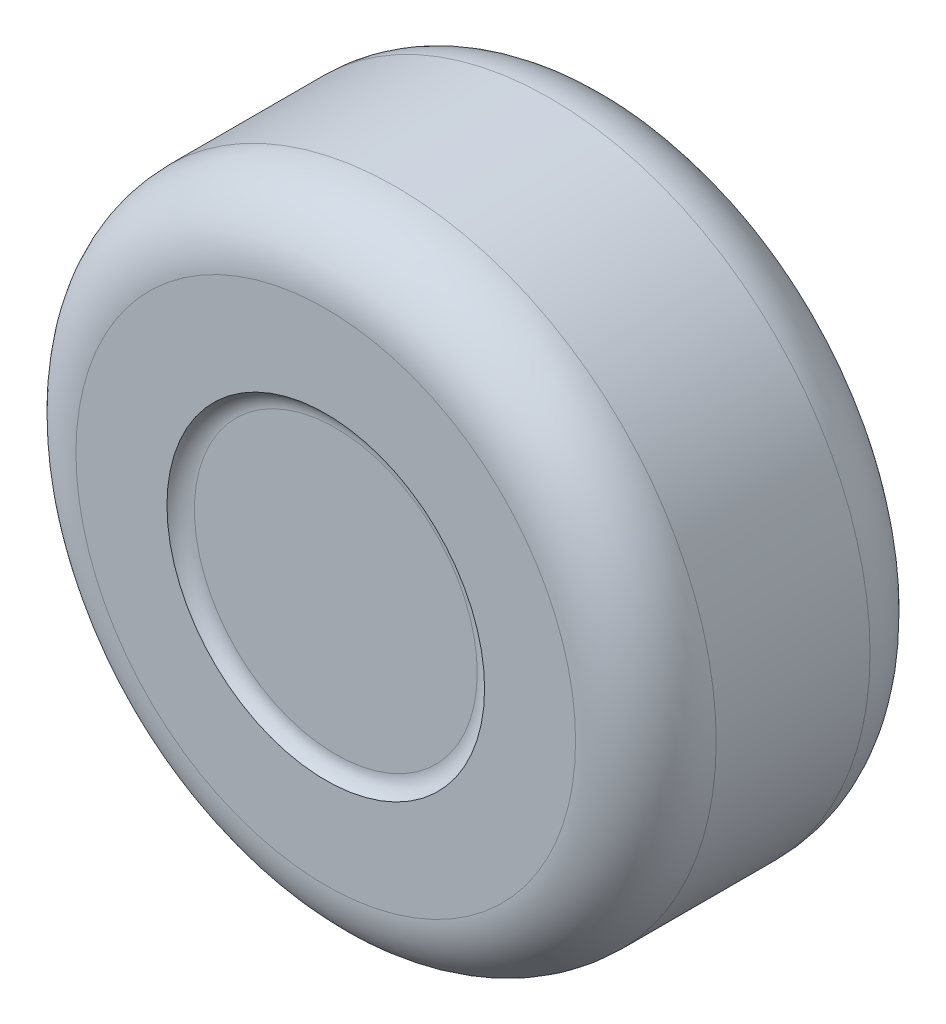
ISO-10303-21;
HEADER;
FILE_DESCRIPTION(('STEP AP214'),'2;1');
FILE_NAME('part.step','',(''),(''),'','','');
FILE_SCHEMA(('AUTOMOTIVE_DESIGN { 1 0 10303 214 1 1 1 1 }'));
ENDSEC;
DATA;
#1=APPLICATION_CONTEXT('core data for automotive mechanical design processes');
#2=APPLICATION_PROTOCOL_DEFINITION('international standard','automotive_design',2000,#1);
#3=PRODUCT_CONTEXT('',#1,'mechanical');
#4=PRODUCT('Part','Part','',(#3));
#5=PRODUCT_RELATED_PRODUCT_CATEGORY('part','',(#4));
#6=PRODUCT_DEFINITION_FORMATION('','',#4);
#7=PRODUCT_DEFINITION_CONTEXT('part definition',#1,'design');
#8=PRODUCT_DEFINITION('design','',#6,#7);
#9=PRODUCT_DEFINITION_SHAPE('','',#8);
#10=(LENGTH_UNIT() NAMED_UNIT(*) SI_UNIT(.MILLI.,.METRE.));
#11=(NAMED_UNIT(*) PLANE_ANGLE_UNIT() SI_UNIT($,.RADIAN.));
#12=(NAMED_UNIT(*) SI_UNIT($,.STERADIAN.) SOLID_ANGLE_UNIT());
#13=UNCERTAINTY_MEASURE_WITH_UNIT(LENGTH_MEASURE(1.E-05),#10,'distance_accuracy_value','');
#14=(GEOMETRIC_REPRESENTATION_CONTEXT(3) GLOBAL_UNCERTAINTY_ASSIGNED_CONTEXT((#13)) GLOBAL_UNIT_ASSIGNED_CONTEXT((#10,
#11,#12)) REPRESENTATION_CONTEXT('',''));
#15=CARTESIAN_POINT('',(0.,0.,0.));
#16=DIRECTION('',(0.,0.,1.));
#17=DIRECTION('',(1.,0.,0.));
#18=AXIS2_PLACEMENT_3D('',#15,#16,#17);
#19=CARTESIAN_POINT('',(0.,0.,29.32));
#20=DIRECTION('',(0.,0.,-1.));
#21=DIRECTION('',(-1.,0.,0.));
#22=AXIS2_PLACEMENT_3D('',#19,#20,#21);
#23=CYLINDRICAL_SURFACE('',#22,63.75);
#24=CARTESIAN_POINT('',(0.,0.,-15.32));
#25=DIRECTION('',(0.,0.,1.));
#26=DIRECTION('',(1.,0.,0.));
#27=AXIS2_PLACEMENT_3D('',#24,#25,#26);
#28=CIRCLE('',#27,63.75);
#29=CARTESIAN_POINT('',(-63.75,0.,-15.32));
#30=VERTEX_POINT('',#29);
#31=EDGE_CURVE('E47',#30,#30,#28,.T.);
#32=CARTESIAN_POINT('',(0.,0.,15.32));
#33=DIRECTION('',(0.,0.,1.));
#34=DIRECTION('',(1.,0.,0.));
#35=AXIS2_PLACEMENT_3D('',#32,#33,#34);
#36=CIRCLE('',#35,63.75);
#37=CARTESIAN_POINT('',(-63.75,0.,15.32));
#38=VERTEX_POINT('',#37);
#39=EDGE_CURVE('E52',#38,#38,#36,.F.);
#40=CARTESIAN_POINT('',(-63.75,0.,-15.32));
#41=CARTESIAN_POINT('',(-63.75,0.,-15.0008333333333));
#42=CARTESIAN_POINT('',(-63.75,0.,-14.6816666666667));
#43=CARTESIAN_POINT('',(-63.75,0.,-14.0433333333333));
#44=CARTESIAN_POINT('',(-63.75,0.,-13.7241666666667));
#45=CARTESIAN_POINT('',(-63.75,0.,-13.0858333333333));
#46=CARTESIAN_POINT('',(-63.75,0.,-12.7666666666667));
#47=CARTESIAN_POINT('',(-63.75,0.,-12.1283333333333));
#48=CARTESIAN_POINT('',(-63.75,0.,-11.8091666666667));
#49=CARTESIAN_POINT('',(-63.75,0.,-11.1708333333333));
#50=CARTESIAN_POINT('',(-63.75,0.,-10.8516666666667));
#51=CARTESIAN_POINT('',(-63.75,0.,-10.2133333333333));
#52=CARTESIAN_POINT('',(-63.75,0.,-9.89416666666667));
#53=CARTESIAN_POINT('',(-63.75,0.,-9.25583333333334));
#54=CARTESIAN_POINT('',(-63.75,0.,-8.93666666666667));
#55=CARTESIAN_POINT('',(-63.75,0.,-8.29833333333334));
#56=CARTESIAN_POINT('',(-63.75,0.,-7.97916666666667));
#57=CARTESIAN_POINT('',(-63.75,0.,-7.34083333333334));
#58=CARTESIAN_POINT('',(-63.75,0.,-7.02166666666667));
#59=CARTESIAN_POINT('',(-63.75,0.,-6.38333333333334));
#60=CARTESIAN_POINT('',(-63.75,0.,-6.06416666666667));
#61=CARTESIAN_POINT('',(-63.75,0.,-5.42583333333334));
#62=CARTESIAN_POINT('',(-63.75,0.,-5.10666666666667));
#63=CARTESIAN_POINT('',(-63.75,0.,-4.46833333333334));
#64=CARTESIAN_POINT('',(-63.75,0.,-4.14916666666667));
#65=CARTESIAN_POINT('',(-63.75,0.,-3.51083333333334));
#66=CARTESIAN_POINT('',(-63.75,0.,-3.19166666666667));
#67=CARTESIAN_POINT('',(-63.75,0.,-2.55333333333334));
#68=CARTESIAN_POINT('',(-63.75,0.,-2.23416666666667));
#69=CARTESIAN_POINT('',(-63.75,0.,-1.59583333333334));
#70=CARTESIAN_POINT('',(-63.75,0.,-1.27666666666667));
#71=CARTESIAN_POINT('',(-63.75,0.,-0.63833333333334));
#72=CARTESIAN_POINT('',(-63.75,0.,-0.319166666666674));
#73=CARTESIAN_POINT('',(-63.75,0.,0.31916666666666));
#74=CARTESIAN_POINT('',(-63.75,0.,0.638333333333326));
#75=CARTESIAN_POINT('',(-63.75,0.,1.27666666666666));
#76=CARTESIAN_POINT('',(-63.75,0.,1.59583333333333));
#77=CARTESIAN_POINT('',(-63.75,0.,2.23416666666666));
#78=CARTESIAN_POINT('',(-63.75,0.,2.55333333333333));
#79=CARTESIAN_POINT('',(-63.75,0.,3.19166666666666));
#80=CARTESIAN_POINT('',(-63.75,0.,3.51083333333333));
#81=CARTESIAN_POINT('',(-63.75,0.,4.14916666666666));
#82=CARTESIAN_POINT('',(-63.75,0.,4.46833333333333));
#83=CARTESIAN_POINT('',(-63.75,0.,5.10666666666666));
#84=CARTESIAN_POINT('',(-63.75,0.,5.42583333333333));
#85=CARTESIAN_POINT('',(-63.75,0.,6.06416666666666));
#86=CARTESIAN_POINT('',(-63.75,0.,6.38333333333333));
#87=CARTESIAN_POINT('',(-63.75,0.,7.02166666666666));
#88=CARTESIAN_POINT('',(-63.75,0.,7.34083333333333));
#89=CARTESIAN_POINT('',(-63.75,0.,7.97916666666666));
#90=CARTESIAN_POINT('',(-63.75,0.,8.29833333333333));
#91=CARTESIAN_POINT('',(-63.75,0.,8.93666666666666));
#92=CARTESIAN_POINT('',(-63.75,0.,9.25583333333333));
#93=CARTESIAN_POINT('',(-63.75,0.,9.89416666666666));
#94=CARTESIAN_POINT('',(-63.75,0.,10.2133333333333));
#95=CARTESIAN_POINT('',(-63.75,0.,10.8516666666667));
#96=CARTESIAN_POINT('',(-63.75,0.,11.1708333333333));
#97=CARTESIAN_POINT('',(-63.75,0.,11.8091666666667));
#98=CARTESIAN_POINT('',(-63.75,0.,12.1283333333333));
#99=CARTESIAN_POINT('',(-63.75,0.,12.7666666666667));
#100=CARTESIAN_POINT('',(-63.75,0.,13.0858333333333));
#101=CARTESIAN_POINT('',(-63.75,0.,13.7241666666667));
#102=CARTESIAN_POINT('',(-63.75,0.,14.0433333333333));
#103=CARTESIAN_POINT('',(-63.75,0.,14.6816666666667));
#104=CARTESIAN_POINT('',(-63.75,0.,15.0008333333333));
#105=CARTESIAN_POINT('',(-63.75,0.,15.32));
#106=B_SPLINE_CURVE_WITH_KNOTS('',3,(#40,#41,#42,#43,#44,#45,#46,#47,#48,#49,#50,#51,#52,#53,
#54,#55,#56,#57,#58,#59,#60,#61,#62,#63,#64,#65,#66,#67,#68,#69,#70,#71,#72,#73,#74,#75,#76,#77,
#78,#79,#80,#81,#82,#83,#84,#85,#86,#87,#88,#89,#90,#91,#92,#93,#94,#95,#96,#97,#98,#99,#100,
#101,#102,#103,#104,#105),.UNSPECIFIED.,.F.,.F.,(4,2,2,2,2,2,2,2,2,2,2,2,2,2,2,2,2,2,2,2,2,2,2,
2,2,2,2,2,2,2,2,2,4),(0.,0.9575,1.915,2.8725,3.83,4.7875,5.745,6.7025,7.66,8.6175,9.575,10.5325,
11.49,12.4475,13.405,14.3625,15.32,16.2775,17.235,18.1925,19.15,20.1075,21.065,22.0225,22.98,
23.9375,24.895,25.8525,26.81,27.7675,28.725,29.6825,30.64),.UNSPECIFIED.);
#107=EDGE_CURVE('BSEAM32',#30,#38,#106,.T.);
#108=ORIENTED_EDGE('',*,*,#31,.T.);
#109=ORIENTED_EDGE('',*,*,#39,.T.);
#110=ORIENTED_EDGE('',*,*,#107,.T.);
#111=ORIENTED_EDGE('',*,*,#107,.F.);
#112=EDGE_LOOP('',(#108,#110,#109,#111));
#113=FACE_BOUND('',#112,.T.);
#114=ADVANCED_FACE('F32',(#113),#23,.T.);
#115=CARTESIAN_POINT('',(0.,0.,29.32));
#116=DIRECTION('',(0.,0.,1.));
#117=DIRECTION('',(1.,0.,0.));
#118=AXIS2_PLACEMENT_3D('',#115,#116,#117);
#119=PLANE('',#118);
#120=CARTESIAN_POINT('',(0.,0.,29.32));
#121=DIRECTION('',(0.,0.,1.));
#122=DIRECTION('',(1.,0.,0.));
#123=AXIS2_PLACEMENT_3D('',#120,#121,#122);
#124=CIRCLE('',#123,49.75);
#125=CARTESIAN_POINT('',(49.75,0.,29.32));
#126=VERTEX_POINT('',#125);
#127=EDGE_CURVE('E55',#126,#126,#124,.T.);
#128=ORIENTED_EDGE('',*,*,#127,.T.);
#129=EDGE_LOOP('',(#128));
#130=FACE_BOUND('',#129,.T.);
#131=CARTESIAN_POINT('',(0.,0.,29.32));
#132=DIRECTION('',(0.,0.,1.));
#133=DIRECTION('',(1.,0.,0.));
#134=AXIS2_PLACEMENT_3D('',#131,#132,#133);
#135=CIRCLE('',#134,31.625);
#136=CARTESIAN_POINT('',(31.625,0.,29.32));
#137=VERTEX_POINT('',#136);
#138=EDGE_CURVE('E61',#137,#137,#135,.T.);
#139=ORIENTED_EDGE('',*,*,#138,.F.);
#140=EDGE_LOOP('',(#139));
#141=FACE_BOUND('',#140,.T.);
#142=ADVANCED_FACE('F104',(#130,#141),#119,.T.);
#143=CARTESIAN_POINT('',(0.,0.,-29.32));
#144=DIRECTION('',(0.,0.,1.));
#145=DIRECTION('',(1.,0.,0.));
#146=AXIS2_PLACEMENT_3D('',#143,#144,#145);
#147=PLANE('',#146);
#148=CARTESIAN_POINT('',(0.,0.,-29.32));
#149=DIRECTION('',(0.,0.,1.));
#150=DIRECTION('',(1.,0.,0.));
#151=AXIS2_PLACEMENT_3D('',#148,#149,#150);
#152=CIRCLE('',#151,49.75);
#153=CARTESIAN_POINT('',(49.75,0.,-29.32));
#154=VERTEX_POINT('',#153);
#155=EDGE_CURVE('E43',#154,#154,#152,.F.);
#156=ORIENTED_EDGE('',*,*,#155,.T.);
#157=EDGE_LOOP('',(#156));
#158=FACE_BOUND('',#157,.T.);
#159=CARTESIAN_POINT('',(0.,0.,-29.32));
#160=DIRECTION('',(0.,0.,-1.));
#161=DIRECTION('',(-1.,0.,0.));
#162=AXIS2_PLACEMENT_3D('',#159,#160,#161);
#163=CIRCLE('',#162,31.625);
#164=CARTESIAN_POINT('',(-31.625,0.,-29.32));
#165=VERTEX_POINT('',#164);
#166=EDGE_CURVE('E64',#165,#165,#163,.T.);
#167=ORIENTED_EDGE('',*,*,#166,.F.);
#168=EDGE_LOOP('',(#167));
#169=FACE_BOUND('',#168,.T.);
#170=ADVANCED_FACE('F110',(#158,#169),#147,.F.);
#171=CARTESIAN_POINT('',(0.,0.,27.32));
#172=DIRECTION('',(0.,0.,1.));
#173=DIRECTION('',(1.,0.,0.));
#174=AXIS2_PLACEMENT_3D('',#171,#172,#173);
#175=PLANE('',#174);
#176=CARTESIAN_POINT('',(0.,0.,27.32));
#177=DIRECTION('',(0.,0.,1.));
#178=DIRECTION('',(1.,0.,0.));
#179=AXIS2_PLACEMENT_3D('',#176,#177,#178);
#180=CIRCLE('',#179,28.1608983848622);
#181=CARTESIAN_POINT('',(28.1608983848622,0.,27.32));
#182=VERTEX_POINT('',#181);
#183=EDGE_CURVE('E58',#182,#182,#180,.T.);
#184=ORIENTED_EDGE('',*,*,#183,.T.);
#185=EDGE_LOOP('',(#184));
#186=FACE_BOUND('',#185,.T.);
#187=ADVANCED_FACE('F120',(#186),#175,.T.);
#188=CARTESIAN_POINT('',(0.,0.,31.32));
#189=DIRECTION('',(0.,0.,-1.));
#190=DIRECTION('',(-1.,0.,0.));
#191=AXIS2_PLACEMENT_3D('',#188,#189,#190);
#192=TOROIDAL_SURFACE('',#191,28.1608983848622,4.);
#193=ORIENTED_EDGE('',*,*,#138,.T.);
#194=EDGE_LOOP('',(#193));
#195=FACE_BOUND('',#194,.T.);
#196=ORIENTED_EDGE('',*,*,#183,.F.);
#197=EDGE_LOOP('',(#196));
#198=FACE_BOUND('',#197,.T.);
#199=ADVANCED_FACE('F116',(#195,#198),#192,.F.);
#200=CARTESIAN_POINT('',(0.,0.,15.32));
#201=DIRECTION('',(0.,0.,1.));
#202=DIRECTION('',(1.,0.,0.));
#203=AXIS2_PLACEMENT_3D('',#200,#201,#202);
#204=TOROIDAL_SURFACE('',#203,49.75,14.);
#205=ORIENTED_EDGE('',*,*,#39,.F.);
#206=EDGE_LOOP('',(#205));
#207=FACE_BOUND('',#206,.T.);
#208=ORIENTED_EDGE('',*,*,#127,.F.);
#209=EDGE_LOOP('',(#208));
#210=FACE_BOUND('',#209,.T.);
#211=ADVANCED_FACE('F119',(#207,#210),#204,.T.);
#212=CARTESIAN_POINT('',(0.,0.,-27.32));
#213=DIRECTION('',(0.,0.,-1.));
#214=DIRECTION('',(-1.,0.,0.));
#215=AXIS2_PLACEMENT_3D('',#212,#213,#214);
#216=PLANE('',#215);
#217=CARTESIAN_POINT('',(0.,0.,-27.32));
#218=DIRECTION('',(0.,0.,-1.));
#219=DIRECTION('',(-1.,0.,0.));
#220=AXIS2_PLACEMENT_3D('',#217,#218,#219);
#221=CIRCLE('',#220,29.625);
#222=CARTESIAN_POINT('',(-29.625,0.,-27.32));
#223=VERTEX_POINT('',#222);
#224=EDGE_CURVE('E10',#223,#223,#221,.T.);
#225=ORIENTED_EDGE('',*,*,#224,.T.);
#226=EDGE_LOOP('',(#225));
#227=FACE_BOUND('',#226,.T.);
#228=CARTESIAN_POINT('',(0.,0.,-27.32));
#229=DIRECTION('',(0.,0.,-1.));
#230=DIRECTION('',(-1.,0.,0.));
#231=AXIS2_PLACEMENT_3D('',#228,#229,#230);
#232=CIRCLE('',#231,29.12);
#233=CARTESIAN_POINT('',(-29.12,0.,-27.32));
#234=VERTEX_POINT('',#233);
#235=EDGE_CURVE('E39',#234,#234,#232,.F.);
#236=ORIENTED_EDGE('',*,*,#235,.T.);
#237=EDGE_LOOP('',(#236));
#238=FACE_BOUND('',#237,.T.);
#239=ADVANCED_FACE('F89',(#227,#238),#216,.T.);
#240=CARTESIAN_POINT('',(0.,0.,-25.32));
#241=DIRECTION('',(0.,0.,-1.));
#242=DIRECTION('',(-1.,0.,0.));
#243=AXIS2_PLACEMENT_3D('',#240,#241,#242);
#244=PLANE('',#243);
#245=CARTESIAN_POINT('',(0.,0.,-25.32));
#246=DIRECTION('',(0.,0.,-1.));
#247=DIRECTION('',(-1.,0.,0.));
#248=AXIS2_PLACEMENT_3D('',#245,#246,#247);
#249=CIRCLE('',#248,4.05);
#250=CARTESIAN_POINT('',(-4.05,0.,-25.32));
#251=VERTEX_POINT('',#250);
#252=EDGE_CURVE('E71',#251,#251,#249,.T.);
#253=ORIENTED_EDGE('',*,*,#252,.F.);
#254=EDGE_LOOP('',(#253));
#255=FACE_BOUND('',#254,.T.);
#256=CARTESIAN_POINT('',(0.,0.,-25.32));
#257=DIRECTION('',(0.,0.,-1.));
#258=DIRECTION('',(-1.,0.,0.));
#259=AXIS2_PLACEMENT_3D('',#256,#257,#258);
#260=CIRCLE('',#259,27.12);
#261=CARTESIAN_POINT('',(-27.12,0.,-25.32));
#262=VERTEX_POINT('',#261);
#263=EDGE_CURVE('E67',#262,#262,#260,.T.);
#264=ORIENTED_EDGE('',*,*,#263,.T.);
#265=EDGE_LOOP('',(#264));
#266=FACE_BOUND('',#265,.T.);
#267=ADVANCED_FACE('F86',(#255,#266),#244,.T.);
#268=CARTESIAN_POINT('',(0.,0.,-15.32));
#269=DIRECTION('',(0.,0.,1.));
#270=DIRECTION('',(1.,0.,0.));
#271=AXIS2_PLACEMENT_3D('',#268,#269,#270);
#272=TOROIDAL_SURFACE('',#271,49.75,14.);
#273=ORIENTED_EDGE('',*,*,#155,.F.);
#274=EDGE_LOOP('',(#273));
#275=FACE_BOUND('',#274,.T.);
#276=ORIENTED_EDGE('',*,*,#31,.F.);
#277=EDGE_LOOP('',(#276));
#278=FACE_BOUND('',#277,.T.);
#279=ADVANCED_FACE('F82',(#275,#278),#272,.T.);
#280=CARTESIAN_POINT('',(0.,0.,4.68));
#281=DIRECTION('',(0.,0.,-1.));
#282=DIRECTION('',(-1.,0.,0.));
#283=AXIS2_PLACEMENT_3D('',#280,#281,#282);
#284=CYLINDRICAL_SURFACE('',#283,4.05);
#285=CARTESIAN_POINT('',(0.,0.,4.68));
#286=DIRECTION('',(0.,0.,-1.));
#287=DIRECTION('',(-1.,0.,0.));
#288=AXIS2_PLACEMENT_3D('',#285,#286,#287);
#289=CIRCLE('',#288,4.05);
#290=CARTESIAN_POINT('',(-4.05,0.,4.68));
#291=VERTEX_POINT('',#290);
#292=EDGE_CURVE('E70',#291,#291,#289,.T.);
#293=ORIENTED_EDGE('',*,*,#292,.F.);
#294=EDGE_LOOP('',(#293));
#295=FACE_BOUND('',#294,.T.);
#296=ORIENTED_EDGE('',*,*,#252,.T.);
#297=EDGE_LOOP('',(#296));
#298=FACE_BOUND('',#297,.T.);
#299=ADVANCED_FACE('F79',(#295,#298),#284,.F.);
#300=CARTESIAN_POINT('',(0.,0.,4.68));
#301=DIRECTION('',(0.,0.,-1.));
#302=DIRECTION('',(-1.,0.,0.));
#303=AXIS2_PLACEMENT_3D('',#300,#301,#302);
#304=PLANE('',#303);
#305=ORIENTED_EDGE('',*,*,#292,.T.);
#306=EDGE_LOOP('',(#305));
#307=FACE_BOUND('',#306,.T.);
#308=ADVANCED_FACE('F77',(#307),#304,.T.);
#309=CARTESIAN_POINT('',(0.,0.,-25.32));
#310=DIRECTION('',(0.,0.,-1.));
#311=DIRECTION('',(-1.,0.,0.));
#312=AXIS2_PLACEMENT_3D('',#309,#310,#311);
#313=TOROIDAL_SURFACE('',#312,29.12,2.);
#314=ORIENTED_EDGE('',*,*,#235,.F.);
#315=EDGE_LOOP('',(#314));
#316=FACE_BOUND('',#315,.T.);
#317=ORIENTED_EDGE('',*,*,#263,.F.);
#318=EDGE_LOOP('',(#317));
#319=FACE_BOUND('',#318,.T.);
#320=ADVANCED_FACE('F93',(#316,#319),#313,.T.);
#321=CARTESIAN_POINT('',(0.,0.,-29.32));
#322=DIRECTION('',(0.,0.,-1.));
#323=DIRECTION('',(-1.,0.,0.));
#324=AXIS2_PLACEMENT_3D('',#321,#322,#323);
#325=TOROIDAL_SURFACE('',#324,29.625,2.);
#326=ORIENTED_EDGE('',*,*,#166,.T.);
#327=EDGE_LOOP('',(#326));
#328=FACE_BOUND('',#327,.T.);
#329=ORIENTED_EDGE('',*,*,#224,.F.);
#330=EDGE_LOOP('',(#329));
#331=FACE_BOUND('',#330,.T.);
#332=ADVANCED_FACE('F34',(#328,#331),#325,.F.);
#333=CLOSED_SHELL('',(#114,#142,#170,#187,#199,#211,#239,#267,#279,#299,#308,#320,#332));
#334=MANIFOLD_SOLID_BREP('B2',#333);
#335=ADVANCED_BREP_SHAPE_REPRESENTATION('',(#18,#334),#14);
#336=SHAPE_DEFINITION_REPRESENTATION(#9,#335);
ENDSEC;
END-ISO-10303-21;
